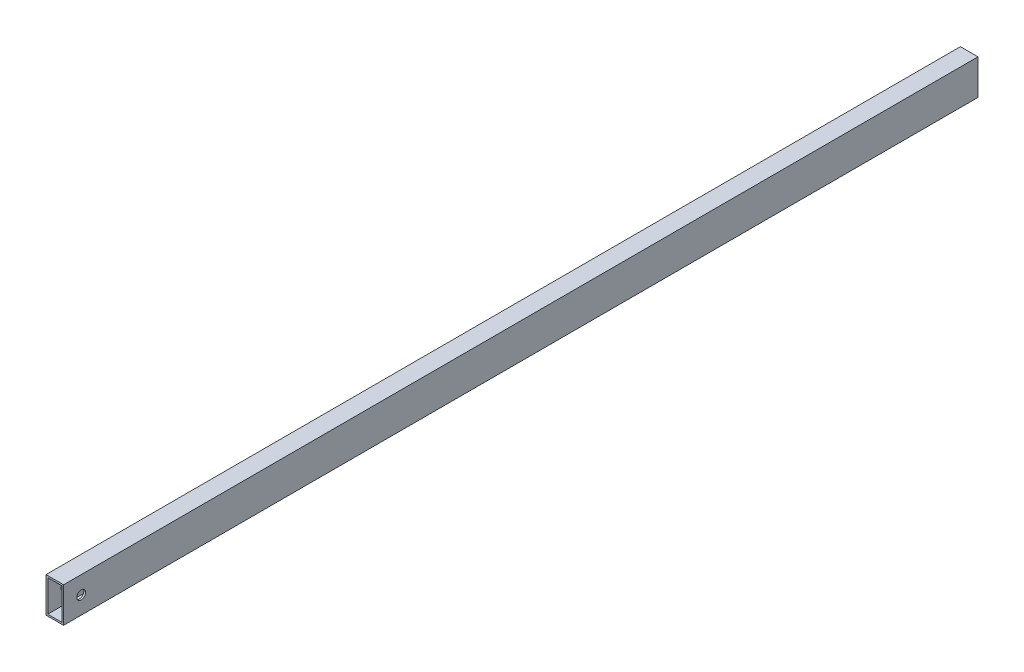
ISO-10303-21;
HEADER;
FILE_DESCRIPTION(('STEP AP214'),'2;1');
FILE_NAME('part.step','',(''),(''),'','','');
FILE_SCHEMA(('AUTOMOTIVE_DESIGN { 1 0 10303 214 1 1 1 1 }'));
ENDSEC;
DATA;
#1=APPLICATION_CONTEXT('core data for automotive mechanical design processes');
#2=APPLICATION_PROTOCOL_DEFINITION('international standard','automotive_design',2000,#1);
#3=PRODUCT_CONTEXT('',#1,'mechanical');
#4=PRODUCT('Part','Part','',(#3));
#5=PRODUCT_RELATED_PRODUCT_CATEGORY('part','',(#4));
#6=PRODUCT_DEFINITION_FORMATION('','',#4);
#7=PRODUCT_DEFINITION_CONTEXT('part definition',#1,'design');
#8=PRODUCT_DEFINITION('design','',#6,#7);
#9=PRODUCT_DEFINITION_SHAPE('','',#8);
#10=(LENGTH_UNIT() NAMED_UNIT(*) SI_UNIT(.MILLI.,.METRE.));
#11=(NAMED_UNIT(*) PLANE_ANGLE_UNIT() SI_UNIT($,.RADIAN.));
#12=(NAMED_UNIT(*) SI_UNIT($,.STERADIAN.) SOLID_ANGLE_UNIT());
#13=UNCERTAINTY_MEASURE_WITH_UNIT(LENGTH_MEASURE(1.E-05),#10,'distance_accuracy_value','');
#14=(GEOMETRIC_REPRESENTATION_CONTEXT(3) GLOBAL_UNCERTAINTY_ASSIGNED_CONTEXT((#13)) GLOBAL_UNIT_ASSIGNED_CONTEXT((#10,
#11,#12)) REPRESENTATION_CONTEXT('',''));
#15=CARTESIAN_POINT('',(0.,0.,0.));
#16=DIRECTION('',(0.,0.,1.));
#17=DIRECTION('',(1.,0.,0.));
#18=AXIS2_PLACEMENT_3D('',#15,#16,#17);
#19=CARTESIAN_POINT('',(0.,0.,1320.8));
#20=DIRECTION('',(0.,0.,-1.));
#21=DIRECTION('',(-1.,0.,0.));
#22=AXIS2_PLACEMENT_3D('',#19,#20,#21);
#23=PLANE('',#22);
#24=DIRECTION('',(0.,-1.,0.));
#25=VECTOR('',#24,1.);
#26=CARTESIAN_POINT('',(0.,0.,1320.8));
#27=LINE('',#26,#25);
#28=CARTESIAN_POINT('',(0.,50.8,1320.8));
#29=VERTEX_POINT('',#28);
#30=CARTESIAN_POINT('',(0.,0.,1320.8));
#31=VERTEX_POINT('',#30);
#32=EDGE_CURVE('E137',#29,#31,#27,.T.);
#33=ORIENTED_EDGE('',*,*,#32,.T.);
#34=DIRECTION('',(1.,0.,0.));
#35=VECTOR('',#34,1.);
#36=CARTESIAN_POINT('',(0.,0.,1320.8));
#37=LINE('',#36,#35);
#38=CARTESIAN_POINT('',(25.4,0.,1320.8));
#39=VERTEX_POINT('',#38);
#40=EDGE_CURVE('E140',#31,#39,#37,.T.);
#41=ORIENTED_EDGE('',*,*,#40,.T.);
#42=DIRECTION('',(0.,1.,0.));
#43=VECTOR('',#42,1.);
#44=CARTESIAN_POINT('',(25.4,0.,1320.8));
#45=LINE('',#44,#43);
#46=CARTESIAN_POINT('',(25.4,50.8,1320.8));
#47=VERTEX_POINT('',#46);
#48=EDGE_CURVE('E143',#39,#47,#45,.T.);
#49=ORIENTED_EDGE('',*,*,#48,.T.);
#50=DIRECTION('',(-1.,0.,0.));
#51=VECTOR('',#50,1.);
#52=CARTESIAN_POINT('',(0.,50.8,1320.8));
#53=LINE('',#52,#51);
#54=EDGE_CURVE('E145',#47,#29,#53,.T.);
#55=ORIENTED_EDGE('',*,*,#54,.T.);
#56=EDGE_LOOP('',(#33,#41,#49,#55));
#57=FACE_BOUND('',#56,.T.);
#58=DIRECTION('',(0.,-1.,0.));
#59=VECTOR('',#58,1.);
#60=CARTESIAN_POINT('',(2.54,2.54,1320.8));
#61=LINE('',#60,#59);
#62=CARTESIAN_POINT('',(2.54,48.26,1320.8));
#63=VERTEX_POINT('',#62);
#64=CARTESIAN_POINT('',(2.54,2.54,1320.8));
#65=VERTEX_POINT('',#64);
#66=EDGE_CURVE('E99',#63,#65,#61,.T.);
#67=ORIENTED_EDGE('',*,*,#66,.F.);
#68=DIRECTION('',(-1.,0.,0.));
#69=VECTOR('',#68,1.);
#70=CARTESIAN_POINT('',(2.54,48.26,1320.8));
#71=LINE('',#70,#69);
#72=CARTESIAN_POINT('',(22.86,48.26,1320.8));
#73=VERTEX_POINT('',#72);
#74=EDGE_CURVE('E121',#73,#63,#71,.T.);
#75=ORIENTED_EDGE('',*,*,#74,.F.);
#76=DIRECTION('',(0.,1.,0.));
#77=VECTOR('',#76,1.);
#78=CARTESIAN_POINT('',(22.86,2.54,1320.8));
#79=LINE('',#78,#77);
#80=CARTESIAN_POINT('',(22.86,2.54,1320.8));
#81=VERTEX_POINT('',#80);
#82=EDGE_CURVE('E119',#81,#73,#79,.T.);
#83=ORIENTED_EDGE('',*,*,#82,.F.);
#84=DIRECTION('',(1.,0.,0.));
#85=VECTOR('',#84,1.);
#86=CARTESIAN_POINT('',(2.54,2.54,1320.8));
#87=LINE('',#86,#85);
#88=EDGE_CURVE('E107',#65,#81,#87,.T.);
#89=ORIENTED_EDGE('',*,*,#88,.F.);
#90=EDGE_LOOP('',(#67,#75,#83,#89));
#91=FACE_BOUND('',#90,.T.);
#92=ADVANCED_FACE('F33',(#57,#91),#23,.F.);
#93=CARTESIAN_POINT('',(0.,0.,0.));
#94=DIRECTION('',(0.,0.,-1.));
#95=DIRECTION('',(-1.,0.,0.));
#96=AXIS2_PLACEMENT_3D('',#93,#94,#95);
#97=PLANE('',#96);
#98=DIRECTION('',(0.,-1.,0.));
#99=VECTOR('',#98,1.);
#100=CARTESIAN_POINT('',(0.,0.,0.));
#101=LINE('',#100,#99);
#102=CARTESIAN_POINT('',(0.,50.8,0.));
#103=VERTEX_POINT('',#102);
#104=CARTESIAN_POINT('',(0.,0.,0.));
#105=VERTEX_POINT('',#104);
#106=EDGE_CURVE('E115',#103,#105,#101,.T.);
#107=ORIENTED_EDGE('',*,*,#106,.F.);
#108=DIRECTION('',(-1.,0.,0.));
#109=VECTOR('',#108,1.);
#110=CARTESIAN_POINT('',(0.,50.8,0.));
#111=LINE('',#110,#109);
#112=CARTESIAN_POINT('',(25.4,50.8,0.));
#113=VERTEX_POINT('',#112);
#114=EDGE_CURVE('E141',#113,#103,#111,.T.);
#115=ORIENTED_EDGE('',*,*,#114,.F.);
#116=DIRECTION('',(0.,1.,0.));
#117=VECTOR('',#116,1.);
#118=CARTESIAN_POINT('',(25.4,0.,0.));
#119=LINE('',#118,#117);
#120=CARTESIAN_POINT('',(25.4,0.,0.));
#121=VERTEX_POINT('',#120);
#122=EDGE_CURVE('E152',#121,#113,#119,.T.);
#123=ORIENTED_EDGE('',*,*,#122,.F.);
#124=DIRECTION('',(1.,0.,0.));
#125=VECTOR('',#124,1.);
#126=CARTESIAN_POINT('',(0.,0.,0.));
#127=LINE('',#126,#125);
#128=EDGE_CURVE('E150',#105,#121,#127,.T.);
#129=ORIENTED_EDGE('',*,*,#128,.F.);
#130=EDGE_LOOP('',(#107,#115,#123,#129));
#131=FACE_BOUND('',#130,.T.);
#132=DIRECTION('',(-1.,0.,0.));
#133=VECTOR('',#132,1.);
#134=CARTESIAN_POINT('',(2.54,48.26,0.));
#135=LINE('',#134,#133);
#136=CARTESIAN_POINT('',(22.86,48.26,0.));
#137=VERTEX_POINT('',#136);
#138=CARTESIAN_POINT('',(2.54,48.26,0.));
#139=VERTEX_POINT('',#138);
#140=EDGE_CURVE('E108',#137,#139,#135,.T.);
#141=ORIENTED_EDGE('',*,*,#140,.T.);
#142=DIRECTION('',(0.,-1.,0.));
#143=VECTOR('',#142,1.);
#144=CARTESIAN_POINT('',(2.54,2.54,0.));
#145=LINE('',#144,#143);
#146=CARTESIAN_POINT('',(2.54,2.54,0.));
#147=VERTEX_POINT('',#146);
#148=EDGE_CURVE('E57',#139,#147,#145,.T.);
#149=ORIENTED_EDGE('',*,*,#148,.T.);
#150=DIRECTION('',(1.,0.,0.));
#151=VECTOR('',#150,1.);
#152=CARTESIAN_POINT('',(2.54,2.54,0.));
#153=LINE('',#152,#151);
#154=CARTESIAN_POINT('',(22.86,2.54,0.));
#155=VERTEX_POINT('',#154);
#156=EDGE_CURVE('E114',#147,#155,#153,.T.);
#157=ORIENTED_EDGE('',*,*,#156,.T.);
#158=DIRECTION('',(0.,1.,0.));
#159=VECTOR('',#158,1.);
#160=CARTESIAN_POINT('',(22.86,2.54,0.));
#161=LINE('',#160,#159);
#162=EDGE_CURVE('E129',#155,#137,#161,.T.);
#163=ORIENTED_EDGE('',*,*,#162,.T.);
#164=EDGE_LOOP('',(#141,#149,#157,#163));
#165=FACE_BOUND('',#164,.T.);
#166=ADVANCED_FACE('F171',(#131,#165),#97,.T.);
#167=CARTESIAN_POINT('',(0.,0.,1320.8));
#168=DIRECTION('',(1.,0.,0.));
#169=DIRECTION('',(0.,0.,-1.));
#170=AXIS2_PLACEMENT_3D('',#167,#168,#169);
#171=PLANE('',#170);
#172=CARTESIAN_POINT('',(0.,25.4,1295.4));
#173=DIRECTION('',(1.,0.,0.));
#174=DIRECTION('',(0.,1.,0.));
#175=AXIS2_PLACEMENT_3D('',#172,#173,#174);
#176=CIRCLE('',#175,6.35000000000016);
#177=CARTESIAN_POINT('',(0.,31.7500000000002,1295.4));
#178=VERTEX_POINT('',#177);
#179=EDGE_CURVE('E212',#178,#178,#176,.T.);
#180=ORIENTED_EDGE('',*,*,#179,.T.);
#181=EDGE_LOOP('',(#180));
#182=FACE_BOUND('',#181,.T.);
#183=ORIENTED_EDGE('',*,*,#106,.T.);
#184=DIRECTION('',(0.,0.,-1.));
#185=VECTOR('',#184,1.);
#186=CARTESIAN_POINT('',(0.,0.,1320.8));
#187=LINE('',#186,#185);
#188=EDGE_CURVE('E11',#31,#105,#187,.T.);
#189=ORIENTED_EDGE('',*,*,#188,.F.);
#190=ORIENTED_EDGE('',*,*,#32,.F.);
#191=DIRECTION('',(0.,0.,-1.));
#192=VECTOR('',#191,1.);
#193=CARTESIAN_POINT('',(0.,50.8,1320.8));
#194=LINE('',#193,#192);
#195=EDGE_CURVE('E147',#29,#103,#194,.T.);
#196=ORIENTED_EDGE('',*,*,#195,.T.);
#197=EDGE_LOOP('',(#183,#189,#190,#196));
#198=FACE_BOUND('',#197,.T.);
#199=ADVANCED_FACE('F35',(#182,#198),#171,.F.);
#200=CARTESIAN_POINT('',(0.,0.,1320.8));
#201=DIRECTION('',(0.,1.,0.));
#202=DIRECTION('',(0.,0.,1.));
#203=AXIS2_PLACEMENT_3D('',#200,#201,#202);
#204=PLANE('',#203);
#205=ORIENTED_EDGE('',*,*,#128,.T.);
#206=DIRECTION('',(0.,0.,-1.));
#207=VECTOR('',#206,1.);
#208=CARTESIAN_POINT('',(25.4,0.,1320.8));
#209=LINE('',#208,#207);
#210=EDGE_CURVE('E42',#39,#121,#209,.T.);
#211=ORIENTED_EDGE('',*,*,#210,.F.);
#212=ORIENTED_EDGE('',*,*,#40,.F.);
#213=ORIENTED_EDGE('',*,*,#188,.T.);
#214=EDGE_LOOP('',(#205,#211,#212,#213));
#215=FACE_BOUND('',#214,.T.);
#216=ADVANCED_FACE('F181',(#215),#204,.F.);
#217=CARTESIAN_POINT('',(25.4,0.,1320.8));
#218=DIRECTION('',(-1.,0.,0.));
#219=DIRECTION('',(0.,-1.,0.));
#220=AXIS2_PLACEMENT_3D('',#217,#218,#219);
#221=PLANE('',#220);
#222=CARTESIAN_POINT('',(25.4,25.4,1295.4));
#223=DIRECTION('',(1.,0.,0.));
#224=DIRECTION('',(0.,1.,0.));
#225=AXIS2_PLACEMENT_3D('',#222,#223,#224);
#226=CIRCLE('',#225,6.35000000000016);
#227=CARTESIAN_POINT('',(25.4,31.7500000000002,1295.4));
#228=VERTEX_POINT('',#227);
#229=EDGE_CURVE('E214',#228,#228,#226,.T.);
#230=ORIENTED_EDGE('',*,*,#229,.F.);
#231=EDGE_LOOP('',(#230));
#232=FACE_BOUND('',#231,.T.);
#233=ORIENTED_EDGE('',*,*,#122,.T.);
#234=DIRECTION('',(0.,0.,-1.));
#235=VECTOR('',#234,1.);
#236=CARTESIAN_POINT('',(25.4,50.8,1320.8));
#237=LINE('',#236,#235);
#238=EDGE_CURVE('E157',#47,#113,#237,.T.);
#239=ORIENTED_EDGE('',*,*,#238,.F.);
#240=ORIENTED_EDGE('',*,*,#48,.F.);
#241=ORIENTED_EDGE('',*,*,#210,.T.);
#242=EDGE_LOOP('',(#233,#239,#240,#241));
#243=FACE_BOUND('',#242,.T.);
#244=ADVANCED_FACE('F165',(#232,#243),#221,.F.);
#245=CARTESIAN_POINT('',(0.,50.8,1320.8));
#246=DIRECTION('',(0.,-1.,0.));
#247=DIRECTION('',(0.,0.,-1.));
#248=AXIS2_PLACEMENT_3D('',#245,#246,#247);
#249=PLANE('',#248);
#250=ORIENTED_EDGE('',*,*,#114,.T.);
#251=ORIENTED_EDGE('',*,*,#195,.F.);
#252=ORIENTED_EDGE('',*,*,#54,.F.);
#253=ORIENTED_EDGE('',*,*,#238,.T.);
#254=EDGE_LOOP('',(#250,#251,#252,#253));
#255=FACE_BOUND('',#254,.T.);
#256=ADVANCED_FACE('F175',(#255),#249,.F.);
#257=CARTESIAN_POINT('',(2.54,2.54,1320.8));
#258=DIRECTION('',(1.,0.,0.));
#259=DIRECTION('',(0.,0.,-1.));
#260=AXIS2_PLACEMENT_3D('',#257,#258,#259);
#261=PLANE('',#260);
#262=CARTESIAN_POINT('',(2.54,25.4,1295.4));
#263=DIRECTION('',(1.,0.,0.));
#264=DIRECTION('',(0.,0.,-1.));
#265=AXIS2_PLACEMENT_3D('',#262,#263,#264);
#266=CIRCLE('',#265,6.35000000000016);
#267=CARTESIAN_POINT('',(2.54,31.7500000000002,1295.4));
#268=VERTEX_POINT('',#267);
#269=EDGE_CURVE('E127',#268,#268,#266,.T.);
#270=ORIENTED_EDGE('',*,*,#269,.F.);
#271=EDGE_LOOP('',(#270));
#272=FACE_BOUND('',#271,.T.);
#273=ORIENTED_EDGE('',*,*,#148,.F.);
#274=DIRECTION('',(0.,0.,-1.));
#275=VECTOR('',#274,1.);
#276=CARTESIAN_POINT('',(2.54,48.26,1320.8));
#277=LINE('',#276,#275);
#278=EDGE_CURVE('E103',#63,#139,#277,.T.);
#279=ORIENTED_EDGE('',*,*,#278,.F.);
#280=ORIENTED_EDGE('',*,*,#66,.T.);
#281=DIRECTION('',(0.,0.,-1.));
#282=VECTOR('',#281,1.);
#283=CARTESIAN_POINT('',(2.54,2.54,1320.8));
#284=LINE('',#283,#282);
#285=EDGE_CURVE('E102',#65,#147,#284,.T.);
#286=ORIENTED_EDGE('',*,*,#285,.T.);
#287=EDGE_LOOP('',(#273,#279,#280,#286));
#288=FACE_BOUND('',#287,.T.);
#289=ADVANCED_FACE('F101',(#272,#288),#261,.T.);
#290=CARTESIAN_POINT('',(2.54,2.54,1320.8));
#291=DIRECTION('',(0.,1.,0.));
#292=DIRECTION('',(0.,0.,1.));
#293=AXIS2_PLACEMENT_3D('',#290,#291,#292);
#294=PLANE('',#293);
#295=ORIENTED_EDGE('',*,*,#156,.F.);
#296=ORIENTED_EDGE('',*,*,#285,.F.);
#297=ORIENTED_EDGE('',*,*,#88,.T.);
#298=DIRECTION('',(0.,0.,-1.));
#299=VECTOR('',#298,1.);
#300=CARTESIAN_POINT('',(22.86,2.54,1320.8));
#301=LINE('',#300,#299);
#302=EDGE_CURVE('E116',#81,#155,#301,.T.);
#303=ORIENTED_EDGE('',*,*,#302,.T.);
#304=EDGE_LOOP('',(#295,#296,#297,#303));
#305=FACE_BOUND('',#304,.T.);
#306=ADVANCED_FACE('F111',(#305),#294,.T.);
#307=CARTESIAN_POINT('',(22.86,2.54,1320.8));
#308=DIRECTION('',(-1.,0.,0.));
#309=DIRECTION('',(0.,-1.,0.));
#310=AXIS2_PLACEMENT_3D('',#307,#308,#309);
#311=PLANE('',#310);
#312=CARTESIAN_POINT('',(22.86,25.4,1295.4));
#313=DIRECTION('',(-1.,0.,0.));
#314=DIRECTION('',(0.,-1.,0.));
#315=AXIS2_PLACEMENT_3D('',#312,#313,#314);
#316=CIRCLE('',#315,6.35000000000016);
#317=CARTESIAN_POINT('',(22.86,31.7500000000002,1295.4));
#318=VERTEX_POINT('',#317);
#319=EDGE_CURVE('E37',#318,#318,#316,.T.);
#320=ORIENTED_EDGE('',*,*,#319,.F.);
#321=EDGE_LOOP('',(#320));
#322=FACE_BOUND('',#321,.T.);
#323=ORIENTED_EDGE('',*,*,#162,.F.);
#324=ORIENTED_EDGE('',*,*,#302,.F.);
#325=ORIENTED_EDGE('',*,*,#82,.T.);
#326=DIRECTION('',(0.,0.,-1.));
#327=VECTOR('',#326,1.);
#328=CARTESIAN_POINT('',(22.86,48.26,1320.8));
#329=LINE('',#328,#327);
#330=EDGE_CURVE('E49',#73,#137,#329,.T.);
#331=ORIENTED_EDGE('',*,*,#330,.T.);
#332=EDGE_LOOP('',(#323,#324,#325,#331));
#333=FACE_BOUND('',#332,.T.);
#334=ADVANCED_FACE('F207',(#322,#333),#311,.T.);
#335=CARTESIAN_POINT('',(2.54,48.26,1320.8));
#336=DIRECTION('',(0.,-1.,0.));
#337=DIRECTION('',(0.,0.,-1.));
#338=AXIS2_PLACEMENT_3D('',#335,#336,#337);
#339=PLANE('',#338);
#340=ORIENTED_EDGE('',*,*,#140,.F.);
#341=ORIENTED_EDGE('',*,*,#330,.F.);
#342=ORIENTED_EDGE('',*,*,#74,.T.);
#343=ORIENTED_EDGE('',*,*,#278,.T.);
#344=EDGE_LOOP('',(#340,#341,#342,#343));
#345=FACE_BOUND('',#344,.T.);
#346=ADVANCED_FACE('F227',(#345),#339,.T.);
#347=CARTESIAN_POINT('',(0.,25.4,1295.4));
#348=DIRECTION('',(1.,0.,0.));
#349=DIRECTION('',(0.,1.,0.));
#350=AXIS2_PLACEMENT_3D('',#347,#348,#349);
#351=CYLINDRICAL_SURFACE('',#350,6.35000000000016);
#352=CARTESIAN_POINT('',(22.86,31.7500000000002,1295.4));
#353=CARTESIAN_POINT('',(22.8864583333333,31.7500000000002,1295.4));
#354=CARTESIAN_POINT('',(22.9129166666667,31.7500000000002,1295.4));
#355=CARTESIAN_POINT('',(22.9658333333333,31.7500000000002,1295.4));
#356=CARTESIAN_POINT('',(22.9922916666667,31.7500000000002,1295.4));
#357=CARTESIAN_POINT('',(23.0452083333333,31.7500000000002,1295.4));
#358=CARTESIAN_POINT('',(23.0716666666667,31.7500000000002,1295.4));
#359=CARTESIAN_POINT('',(23.1245833333333,31.7500000000002,1295.4));
#360=CARTESIAN_POINT('',(23.1510416666667,31.7500000000002,1295.4));
#361=CARTESIAN_POINT('',(23.2039583333333,31.7500000000002,1295.4));
#362=CARTESIAN_POINT('',(23.2304166666667,31.7500000000002,1295.4));
#363=CARTESIAN_POINT('',(23.2833333333333,31.7500000000002,1295.4));
#364=CARTESIAN_POINT('',(23.3097916666667,31.7500000000002,1295.4));
#365=CARTESIAN_POINT('',(23.3627083333333,31.7500000000002,1295.4));
#366=CARTESIAN_POINT('',(23.3891666666667,31.7500000000002,1295.4));
#367=CARTESIAN_POINT('',(23.4420833333333,31.7500000000002,1295.4));
#368=CARTESIAN_POINT('',(23.4685416666667,31.7500000000002,1295.4));
#369=CARTESIAN_POINT('',(23.5214583333333,31.7500000000002,1295.4));
#370=CARTESIAN_POINT('',(23.5479166666667,31.7500000000002,1295.4));
#371=CARTESIAN_POINT('',(23.6008333333333,31.7500000000002,1295.4));
#372=CARTESIAN_POINT('',(23.6272916666667,31.7500000000002,1295.4));
#373=CARTESIAN_POINT('',(23.6802083333333,31.7500000000002,1295.4));
#374=CARTESIAN_POINT('',(23.7066666666667,31.7500000000002,1295.4));
#375=CARTESIAN_POINT('',(23.7595833333333,31.7500000000002,1295.4));
#376=CARTESIAN_POINT('',(23.7860416666667,31.7500000000002,1295.4));
#377=CARTESIAN_POINT('',(23.8389583333333,31.7500000000002,1295.4));
#378=CARTESIAN_POINT('',(23.8654166666667,31.7500000000002,1295.4));
#379=CARTESIAN_POINT('',(23.9183333333333,31.7500000000002,1295.4));
#380=CARTESIAN_POINT('',(23.9447916666667,31.7500000000002,1295.4));
#381=CARTESIAN_POINT('',(23.9977083333333,31.7500000000002,1295.4));
#382=CARTESIAN_POINT('',(24.0241666666667,31.7500000000002,1295.4));
#383=CARTESIAN_POINT('',(24.0770833333333,31.7500000000002,1295.4));
#384=CARTESIAN_POINT('',(24.1035416666667,31.7500000000002,1295.4));
#385=CARTESIAN_POINT('',(24.1564583333333,31.7500000000002,1295.4));
#386=CARTESIAN_POINT('',(24.1829166666667,31.7500000000002,1295.4));
#387=CARTESIAN_POINT('',(24.2358333333333,31.7500000000002,1295.4));
#388=CARTESIAN_POINT('',(24.2622916666667,31.7500000000002,1295.4));
#389=CARTESIAN_POINT('',(24.3152083333333,31.7500000000002,1295.4));
#390=CARTESIAN_POINT('',(24.3416666666667,31.7500000000002,1295.4));
#391=CARTESIAN_POINT('',(24.3945833333333,31.7500000000002,1295.4));
#392=CARTESIAN_POINT('',(24.4210416666667,31.7500000000002,1295.4));
#393=CARTESIAN_POINT('',(24.4739583333333,31.7500000000002,1295.4));
#394=CARTESIAN_POINT('',(24.5004166666667,31.7500000000002,1295.4));
#395=CARTESIAN_POINT('',(24.5533333333333,31.7500000000002,1295.4));
#396=CARTESIAN_POINT('',(24.5797916666667,31.7500000000002,1295.4));
#397=CARTESIAN_POINT('',(24.6327083333333,31.7500000000002,1295.4));
#398=CARTESIAN_POINT('',(24.6591666666667,31.7500000000002,1295.4));
#399=CARTESIAN_POINT('',(24.7120833333333,31.7500000000002,1295.4));
#400=CARTESIAN_POINT('',(24.7385416666667,31.7500000000002,1295.4));
#401=CARTESIAN_POINT('',(24.7914583333333,31.7500000000002,1295.4));
#402=CARTESIAN_POINT('',(24.8179166666667,31.7500000000002,1295.4));
#403=CARTESIAN_POINT('',(24.8708333333333,31.7500000000002,1295.4));
#404=CARTESIAN_POINT('',(24.8972916666667,31.7500000000002,1295.4));
#405=CARTESIAN_POINT('',(24.9502083333333,31.7500000000002,1295.4));
#406=CARTESIAN_POINT('',(24.9766666666667,31.7500000000002,1295.4));
#407=CARTESIAN_POINT('',(25.0295833333333,31.7500000000002,1295.4));
#408=CARTESIAN_POINT('',(25.0560416666667,31.7500000000002,1295.4));
#409=CARTESIAN_POINT('',(25.1089583333333,31.7500000000002,1295.4));
#410=CARTESIAN_POINT('',(25.1354166666667,31.7500000000002,1295.4));
#411=CARTESIAN_POINT('',(25.1883333333333,31.7500000000002,1295.4));
#412=CARTESIAN_POINT('',(25.2147916666667,31.7500000000002,1295.4));
#413=CARTESIAN_POINT('',(25.2677083333333,31.7500000000002,1295.4));
#414=CARTESIAN_POINT('',(25.2941666666667,31.7500000000002,1295.4));
#415=CARTESIAN_POINT('',(25.3470833333333,31.7500000000002,1295.4));
#416=CARTESIAN_POINT('',(25.3735416666667,31.7500000000002,1295.4));
#417=CARTESIAN_POINT('',(25.4,31.7500000000002,1295.4));
#418=B_SPLINE_CURVE_WITH_KNOTS('',3,(#352,#353,#354,#355,#356,#357,#358,#359,#360,#361,#362,
#363,#364,#365,#366,#367,#368,#369,#370,#371,#372,#373,#374,#375,#376,#377,#378,#379,#380,#381,
#382,#383,#384,#385,#386,#387,#388,#389,#390,#391,#392,#393,#394,#395,#396,#397,#398,#399,#400,
#401,#402,#403,#404,#405,#406,#407,#408,#409,#410,#411,#412,#413,#414,#415,#416,#417),
.UNSPECIFIED.,.F.,.F.,(4,2,2,2,2,2,2,2,2,2,2,2,2,2,2,2,2,2,2,2,2,2,2,2,2,2,2,2,2,2,2,2,4),(0.,
0.0793749999999996,0.158749999999999,0.238124999999999,0.317499999999998,0.396874999999998,
0.476249999999998,0.555624999999997,0.634999999999997,0.714375,0.793749999999999,
0.873124999999999,0.952499999999998,1.031875,1.11125,1.190625,1.27,1.349375,1.42875,1.508125,
1.5875,1.66687499999999,1.74624999999999,1.82562499999999,1.905,1.984375,2.06375,2.143125,
2.2225,2.301875,2.38124999999999,2.46062499999999,2.53999999999999),.UNSPECIFIED.);
#419=EDGE_CURVE('BSEAM222',#318,#228,#418,.T.);
#420=ORIENTED_EDGE('',*,*,#319,.T.);
#421=ORIENTED_EDGE('',*,*,#229,.T.);
#422=ORIENTED_EDGE('',*,*,#419,.T.);
#423=ORIENTED_EDGE('',*,*,#419,.F.);
#424=EDGE_LOOP('',(#420,#422,#421,#423));
#425=FACE_BOUND('',#424,.T.);
#426=ADVANCED_FACE('F222',(#425),#351,.F.);
#427=CARTESIAN_POINT('',(2.54,31.7500000000002,1295.4));
#428=CARTESIAN_POINT('',(2.51354166666667,31.7500000000002,1295.4));
#429=CARTESIAN_POINT('',(2.48708333333333,31.7500000000002,1295.4));
#430=CARTESIAN_POINT('',(2.43416666666667,31.7500000000002,1295.4));
#431=CARTESIAN_POINT('',(2.40770833333333,31.7500000000002,1295.4));
#432=CARTESIAN_POINT('',(2.35479166666667,31.7500000000002,1295.4));
#433=CARTESIAN_POINT('',(2.32833333333333,31.7500000000002,1295.4));
#434=CARTESIAN_POINT('',(2.27541666666667,31.7500000000002,1295.4));
#435=CARTESIAN_POINT('',(2.24895833333333,31.7500000000002,1295.4));
#436=CARTESIAN_POINT('',(2.19604166666667,31.7500000000002,1295.4));
#437=CARTESIAN_POINT('',(2.16958333333333,31.7500000000002,1295.4));
#438=CARTESIAN_POINT('',(2.11666666666666,31.7500000000002,1295.4));
#439=CARTESIAN_POINT('',(2.09020833333333,31.7500000000002,1295.4));
#440=CARTESIAN_POINT('',(2.03729166666666,31.7500000000002,1295.4));
#441=CARTESIAN_POINT('',(2.01083333333333,31.7500000000002,1295.4));
#442=CARTESIAN_POINT('',(1.95791666666666,31.7500000000002,1295.4));
#443=CARTESIAN_POINT('',(1.93145833333333,31.7500000000002,1295.4));
#444=CARTESIAN_POINT('',(1.87854166666666,31.7500000000002,1295.4));
#445=CARTESIAN_POINT('',(1.85208333333333,31.7500000000002,1295.4));
#446=CARTESIAN_POINT('',(1.79916666666666,31.7500000000002,1295.4));
#447=CARTESIAN_POINT('',(1.77270833333333,31.7500000000002,1295.4));
#448=CARTESIAN_POINT('',(1.71979166666666,31.7500000000002,1295.4));
#449=CARTESIAN_POINT('',(1.69333333333333,31.7500000000002,1295.4));
#450=CARTESIAN_POINT('',(1.64041666666666,31.7500000000002,1295.4));
#451=CARTESIAN_POINT('',(1.61395833333333,31.7500000000002,1295.4));
#452=CARTESIAN_POINT('',(1.56104166666666,31.7500000000002,1295.4));
#453=CARTESIAN_POINT('',(1.53458333333333,31.7500000000002,1295.4));
#454=CARTESIAN_POINT('',(1.48166666666666,31.7500000000002,1295.4));
#455=CARTESIAN_POINT('',(1.45520833333333,31.7500000000002,1295.4));
#456=CARTESIAN_POINT('',(1.40229166666666,31.7500000000002,1295.4));
#457=CARTESIAN_POINT('',(1.37583333333333,31.7500000000002,1295.4));
#458=CARTESIAN_POINT('',(1.32291666666666,31.7500000000002,1295.4));
#459=CARTESIAN_POINT('',(1.29645833333333,31.7500000000002,1295.4));
#460=CARTESIAN_POINT('',(1.24354166666666,31.7500000000002,1295.4));
#461=CARTESIAN_POINT('',(1.21708333333333,31.7500000000002,1295.4));
#462=CARTESIAN_POINT('',(1.16416666666666,31.7500000000002,1295.4));
#463=CARTESIAN_POINT('',(1.13770833333333,31.7500000000002,1295.4));
#464=CARTESIAN_POINT('',(1.08479166666666,31.7500000000002,1295.4));
#465=CARTESIAN_POINT('',(1.05833333333333,31.7500000000002,1295.4));
#466=CARTESIAN_POINT('',(1.00541666666666,31.7500000000002,1295.4));
#467=CARTESIAN_POINT('',(0.978958333333328,31.7500000000002,1295.4));
#468=CARTESIAN_POINT('',(0.926041666666661,31.7500000000002,1295.4));
#469=CARTESIAN_POINT('',(0.899583333333328,31.7500000000002,1295.4));
#470=CARTESIAN_POINT('',(0.846666666666661,31.7500000000002,1295.4));
#471=CARTESIAN_POINT('',(0.820208333333328,31.7500000000002,1295.4));
#472=CARTESIAN_POINT('',(0.767291666666661,31.7500000000002,1295.4));
#473=CARTESIAN_POINT('',(0.740833333333327,31.7500000000002,1295.4));
#474=CARTESIAN_POINT('',(0.68791666666666,31.7500000000002,1295.4));
#475=CARTESIAN_POINT('',(0.661458333333327,31.7500000000002,1295.4));
#476=CARTESIAN_POINT('',(0.60854166666666,31.7500000000002,1295.4));
#477=CARTESIAN_POINT('',(0.582083333333327,31.7500000000002,1295.4));
#478=CARTESIAN_POINT('',(0.52916666666666,31.7500000000002,1295.4));
#479=CARTESIAN_POINT('',(0.502708333333326,31.7500000000002,1295.4));
#480=CARTESIAN_POINT('',(0.44979166666666,31.7500000000002,1295.4));
#481=CARTESIAN_POINT('',(0.423333333333326,31.7500000000002,1295.4));
#482=CARTESIAN_POINT('',(0.370416666666659,31.7500000000002,1295.4));
#483=CARTESIAN_POINT('',(0.343958333333326,31.7500000000002,1295.4));
#484=CARTESIAN_POINT('',(0.291041666666659,31.7500000000002,1295.4));
#485=CARTESIAN_POINT('',(0.264583333333326,31.7500000000002,1295.4));
#486=CARTESIAN_POINT('',(0.211666666666659,31.7500000000002,1295.4));
#487=CARTESIAN_POINT('',(0.185208333333325,31.7500000000002,1295.4));
#488=CARTESIAN_POINT('',(0.132291666666658,31.7500000000002,1295.4));
#489=CARTESIAN_POINT('',(0.105833333333325,31.7500000000002,1295.4));
#490=CARTESIAN_POINT('',(0.0529166666666583,31.7500000000002,1295.4));
#491=CARTESIAN_POINT('',(0.0264583333333248,31.7500000000002,1295.4));
#492=CARTESIAN_POINT('',(0.,31.7500000000002,1295.4));
#493=B_SPLINE_CURVE_WITH_KNOTS('',3,(#427,#428,#429,#430,#431,#432,#433,#434,#435,#436,#437,
#438,#439,#440,#441,#442,#443,#444,#445,#446,#447,#448,#449,#450,#451,#452,#453,#454,#455,#456,
#457,#458,#459,#460,#461,#462,#463,#464,#465,#466,#467,#468,#469,#470,#471,#472,#473,#474,#475,
#476,#477,#478,#479,#480,#481,#482,#483,#484,#485,#486,#487,#488,#489,#490,#491,#492),
.UNSPECIFIED.,.F.,.F.,(4,2,2,2,2,2,2,2,2,2,2,2,2,2,2,2,2,2,2,2,2,2,2,2,2,2,2,2,2,2,2,2,4),(0.,
0.0793750000000004,0.15875,0.238125000000001,0.317500000000001,0.396875000000001,
0.476250000000002,0.555625000000002,0.635000000000002,0.714375000000002,0.793750000000003,
0.873125000000003,0.952500000000003,1.031875,1.11125,1.190625,1.27,1.349375,1.42875,
1.50812500000001,1.58750000000001,1.66687500000001,1.74625000000001,1.82562500000001,
1.90500000000001,1.98437500000001,2.06375000000001,2.14312500000001,2.22250000000001,
2.30187500000001,2.38125000000001,2.46062500000001,2.54000000000001),.UNSPECIFIED.);
#494=EDGE_CURVE('BSEAM220',#268,#178,#493,.T.);
#495=ORIENTED_EDGE('',*,*,#269,.T.);
#496=ORIENTED_EDGE('',*,*,#179,.F.);
#497=ORIENTED_EDGE('',*,*,#494,.T.);
#498=ORIENTED_EDGE('',*,*,#494,.F.);
#499=EDGE_LOOP('',(#495,#497,#496,#498));
#500=FACE_BOUND('',#499,.T.);
#501=ADVANCED_FACE('F220',(#500),#351,.F.);
#502=CLOSED_SHELL('',(#92,#166,#199,#216,#244,#256,#289,#306,#334,#346,#426,#501));
#503=MANIFOLD_SOLID_BREP('B2',#502);
#504=ADVANCED_BREP_SHAPE_REPRESENTATION('',(#18,#503),#14);
#505=SHAPE_DEFINITION_REPRESENTATION(#9,#504);
ENDSEC;
END-ISO-10303-21;
